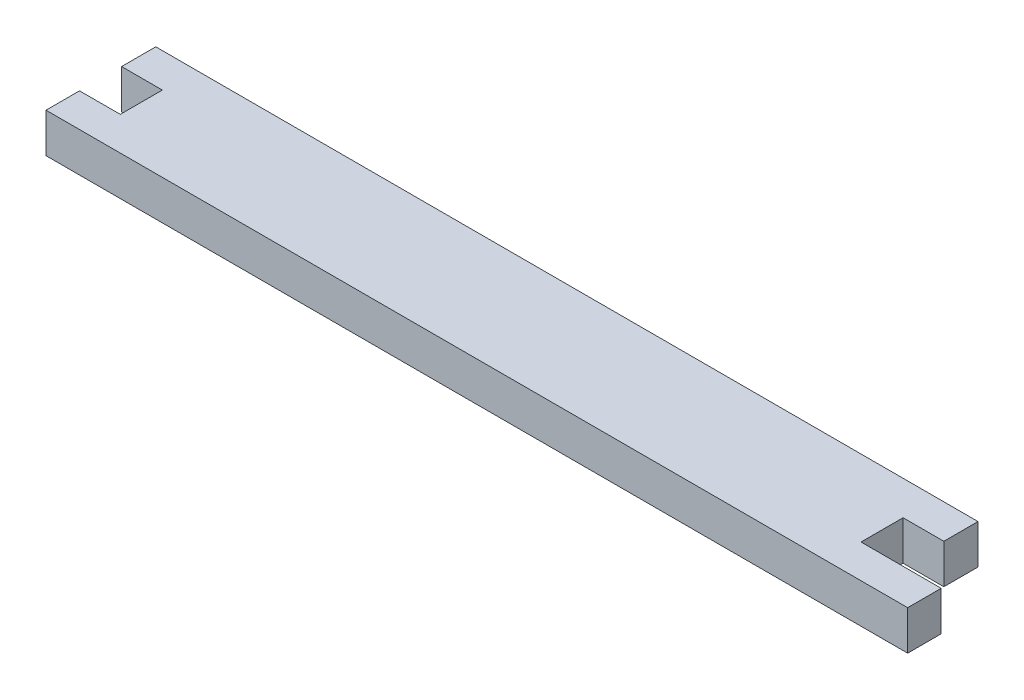
ISO-10303-21;
HEADER;
FILE_DESCRIPTION(('STEP AP214'),'2;1');
FILE_NAME('part.step','',(''),(''),'','','');
FILE_SCHEMA(('AUTOMOTIVE_DESIGN { 1 0 10303 214 1 1 1 1 }'));
ENDSEC;
DATA;
#1=APPLICATION_CONTEXT('core data for automotive mechanical design processes');
#2=APPLICATION_PROTOCOL_DEFINITION('international standard','automotive_design',2000,#1);
#3=PRODUCT_CONTEXT('',#1,'mechanical');
#4=PRODUCT('Part','Part','',(#3));
#5=PRODUCT_RELATED_PRODUCT_CATEGORY('part','',(#4));
#6=PRODUCT_DEFINITION_FORMATION('','',#4);
#7=PRODUCT_DEFINITION_CONTEXT('part definition',#1,'design');
#8=PRODUCT_DEFINITION('design','',#6,#7);
#9=PRODUCT_DEFINITION_SHAPE('','',#8);
#10=(LENGTH_UNIT() NAMED_UNIT(*) SI_UNIT(.MILLI.,.METRE.));
#11=(NAMED_UNIT(*) PLANE_ANGLE_UNIT() SI_UNIT($,.RADIAN.));
#12=(NAMED_UNIT(*) SI_UNIT($,.STERADIAN.) SOLID_ANGLE_UNIT());
#13=UNCERTAINTY_MEASURE_WITH_UNIT(LENGTH_MEASURE(1.E-05),#10,'distance_accuracy_value','');
#14=(GEOMETRIC_REPRESENTATION_CONTEXT(3) GLOBAL_UNCERTAINTY_ASSIGNED_CONTEXT((#13)) GLOBAL_UNIT_ASSIGNED_CONTEXT((#10,
#11,#12)) REPRESENTATION_CONTEXT('',''));
#15=CARTESIAN_POINT('',(0.,0.,0.));
#16=DIRECTION('',(0.,0.,1.));
#17=DIRECTION('',(1.,0.,0.));
#18=AXIS2_PLACEMENT_3D('',#15,#16,#17);
#19=CARTESIAN_POINT('',(-9.87424854704998,16.16,-16.8));
#20=DIRECTION('',(0.,-1.,0.));
#21=DIRECTION('',(0.,0.,-1.));
#22=AXIS2_PLACEMENT_3D('',#19,#20,#21);
#23=PLANE('',#22);
#24=DIRECTION('',(0.,0.,1.));
#25=VECTOR('',#24,1.);
#26=CARTESIAN_POINT('',(-0.999999999999997,16.16,-16.8));
#27=LINE('',#26,#25);
#28=CARTESIAN_POINT('',(-0.999999999999997,16.16,-16.8));
#29=VERTEX_POINT('',#28);
#30=CARTESIAN_POINT('',(-0.999999999999997,16.16,-14.2));
#31=VERTEX_POINT('',#30);
#32=EDGE_CURVE('E36',#29,#31,#27,.T.);
#33=ORIENTED_EDGE('',*,*,#32,.T.);
#34=DIRECTION('',(1.,0.,0.));
#35=VECTOR('',#34,1.);
#36=CARTESIAN_POINT('',(-9.87424854704998,16.16,-14.2));
#37=LINE('',#36,#35);
#38=CARTESIAN_POINT('',(2.1,16.16,-14.2));
#39=VERTEX_POINT('',#38);
#40=EDGE_CURVE('E172',#31,#39,#37,.T.);
#41=ORIENTED_EDGE('',*,*,#40,.T.);
#42=DIRECTION('',(0.,0.,1.));
#43=VECTOR('',#42,1.);
#44=CARTESIAN_POINT('',(2.1,16.16,-16.8));
#45=LINE('',#44,#43);
#46=CARTESIAN_POINT('',(2.1,16.16,-11.));
#47=VERTEX_POINT('',#46);
#48=EDGE_CURVE('E175',#39,#47,#45,.T.);
#49=ORIENTED_EDGE('',*,*,#48,.T.);
#50=DIRECTION('',(-1.,0.,0.));
#51=VECTOR('',#50,1.);
#52=CARTESIAN_POINT('',(-9.87424854704998,16.16,-11.));
#53=LINE('',#52,#51);
#54=CARTESIAN_POINT('',(-0.999999999999997,16.16,-11.));
#55=VERTEX_POINT('',#54);
#56=EDGE_CURVE('E165',#47,#55,#53,.T.);
#57=ORIENTED_EDGE('',*,*,#56,.T.);
#58=CARTESIAN_POINT('',(-0.999999999999997,16.16,-8.448216521316));
#59=VERTEX_POINT('',#58);
#60=EDGE_CURVE('E132',#55,#59,#27,.T.);
#61=ORIENTED_EDGE('',*,*,#60,.T.);
#62=DIRECTION('',(1.,0.,0.));
#63=VECTOR('',#62,1.);
#64=CARTESIAN_POINT('',(-9.87424854704998,16.16,-8.448216521316));
#65=LINE('',#64,#63);
#66=CARTESIAN_POINT('',(64.56,16.16,-8.448216521316));
#67=VERTEX_POINT('',#66);
#68=EDGE_CURVE('E123',#59,#67,#65,.T.);
#69=ORIENTED_EDGE('',*,*,#68,.T.);
#70=DIRECTION('',(0.,0.,1.));
#71=VECTOR('',#70,1.);
#72=CARTESIAN_POINT('',(64.56,16.16,-11.));
#73=LINE('',#72,#71);
#74=CARTESIAN_POINT('',(64.56,16.16,-11.));
#75=VERTEX_POINT('',#74);
#76=EDGE_CURVE('E128',#75,#67,#73,.T.);
#77=ORIENTED_EDGE('',*,*,#76,.F.);
#78=DIRECTION('',(-1.,0.,0.));
#79=VECTOR('',#78,1.);
#80=CARTESIAN_POINT('',(-9.87424854704998,16.16,-11.));
#81=LINE('',#80,#79);
#82=CARTESIAN_POINT('',(58.46,16.16,-11.));
#83=VERTEX_POINT('',#82);
#84=EDGE_CURVE('E194',#75,#83,#81,.T.);
#85=ORIENTED_EDGE('',*,*,#84,.T.);
#86=DIRECTION('',(0.,0.,-1.));
#87=VECTOR('',#86,1.);
#88=CARTESIAN_POINT('',(58.46,16.16,-16.8));
#89=LINE('',#88,#87);
#90=CARTESIAN_POINT('',(58.46,16.16,-14.2));
#91=VERTEX_POINT('',#90);
#92=EDGE_CURVE('E196',#83,#91,#89,.T.);
#93=ORIENTED_EDGE('',*,*,#92,.T.);
#94=DIRECTION('',(1.,0.,0.));
#95=VECTOR('',#94,1.);
#96=CARTESIAN_POINT('',(-9.87424854704998,16.16,-14.2));
#97=LINE('',#96,#95);
#98=CARTESIAN_POINT('',(61.56,16.16,-14.2));
#99=VERTEX_POINT('',#98);
#100=EDGE_CURVE('E188',#91,#99,#97,.T.);
#101=ORIENTED_EDGE('',*,*,#100,.T.);
#102=DIRECTION('',(0.,0.,-1.));
#103=VECTOR('',#102,1.);
#104=CARTESIAN_POINT('',(61.56,16.16,-16.8));
#105=LINE('',#104,#103);
#106=CARTESIAN_POINT('',(61.56,16.16,-16.8));
#107=VERTEX_POINT('',#106);
#108=EDGE_CURVE('E210',#99,#107,#105,.T.);
#109=ORIENTED_EDGE('',*,*,#108,.T.);
#110=DIRECTION('',(1.,0.,0.));
#111=VECTOR('',#110,1.);
#112=CARTESIAN_POINT('',(-9.87424854704998,16.16,-16.8));
#113=LINE('',#112,#111);
#114=EDGE_CURVE('E137',#29,#107,#113,.T.);
#115=ORIENTED_EDGE('',*,*,#114,.F.);
#116=EDGE_LOOP('',(#33,#41,#49,#57,#61,#69,#77,#85,#93,#101,#109,#115));
#117=FACE_BOUND('',#116,.T.);
#118=ADVANCED_FACE('F32',(#117),#23,.F.);
#119=CARTESIAN_POINT('',(-9.87424854704998,13.16,-16.8));
#120=DIRECTION('',(0.,1.,0.));
#121=DIRECTION('',(0.,0.,1.));
#122=AXIS2_PLACEMENT_3D('',#119,#120,#121);
#123=PLANE('',#122);
#124=DIRECTION('',(0.,0.,1.));
#125=VECTOR('',#124,1.);
#126=CARTESIAN_POINT('',(2.1,13.16,-14.2));
#127=LINE('',#126,#125);
#128=CARTESIAN_POINT('',(2.1,13.16,-14.2));
#129=VERTEX_POINT('',#128);
#130=CARTESIAN_POINT('',(2.1,13.16,-11.));
#131=VERTEX_POINT('',#130);
#132=EDGE_CURVE('E151',#129,#131,#127,.T.);
#133=ORIENTED_EDGE('',*,*,#132,.F.);
#134=DIRECTION('',(1.,0.,0.));
#135=VECTOR('',#134,1.);
#136=CARTESIAN_POINT('',(-0.999999999999997,13.16,-14.2));
#137=LINE('',#136,#135);
#138=CARTESIAN_POINT('',(-0.999999999999997,13.16,-14.2));
#139=VERTEX_POINT('',#138);
#140=EDGE_CURVE('E159',#139,#129,#137,.T.);
#141=ORIENTED_EDGE('',*,*,#140,.F.);
#142=DIRECTION('',(0.,0.,-1.));
#143=VECTOR('',#142,1.);
#144=CARTESIAN_POINT('',(-0.999999999999997,13.16,-16.8));
#145=LINE('',#144,#143);
#146=CARTESIAN_POINT('',(-0.999999999999997,13.16,-16.8));
#147=VERTEX_POINT('',#146);
#148=EDGE_CURVE('E202',#139,#147,#145,.T.);
#149=ORIENTED_EDGE('',*,*,#148,.T.);
#150=DIRECTION('',(1.,0.,0.));
#151=VECTOR('',#150,1.);
#152=CARTESIAN_POINT('',(-9.87424854704998,13.16,-16.8));
#153=LINE('',#152,#151);
#154=CARTESIAN_POINT('',(61.56,13.16,-16.8));
#155=VERTEX_POINT('',#154);
#156=EDGE_CURVE('E214',#147,#155,#153,.T.);
#157=ORIENTED_EDGE('',*,*,#156,.T.);
#158=DIRECTION('',(0.,0.,1.));
#159=VECTOR('',#158,1.);
#160=CARTESIAN_POINT('',(61.56,13.16,-16.8));
#161=LINE('',#160,#159);
#162=CARTESIAN_POINT('',(61.56,13.16,-14.2));
#163=VERTEX_POINT('',#162);
#164=EDGE_CURVE('E207',#155,#163,#161,.T.);
#165=ORIENTED_EDGE('',*,*,#164,.T.);
#166=DIRECTION('',(1.,0.,0.));
#167=VECTOR('',#166,1.);
#168=CARTESIAN_POINT('',(61.56,13.16,-14.2));
#169=LINE('',#168,#167);
#170=CARTESIAN_POINT('',(58.46,13.16,-14.2));
#171=VERTEX_POINT('',#170);
#172=EDGE_CURVE('E57',#171,#163,#169,.T.);
#173=ORIENTED_EDGE('',*,*,#172,.F.);
#174=DIRECTION('',(0.,0.,-1.));
#175=VECTOR('',#174,1.);
#176=CARTESIAN_POINT('',(58.46,13.16,-14.2));
#177=LINE('',#176,#175);
#178=CARTESIAN_POINT('',(58.46,13.16,-11.));
#179=VERTEX_POINT('',#178);
#180=EDGE_CURVE('E178',#179,#171,#177,.T.);
#181=ORIENTED_EDGE('',*,*,#180,.F.);
#182=DIRECTION('',(-1.,0.,0.));
#183=VECTOR('',#182,1.);
#184=CARTESIAN_POINT('',(58.46,13.16,-11.));
#185=LINE('',#184,#183);
#186=CARTESIAN_POINT('',(64.56,13.16,-11.));
#187=VERTEX_POINT('',#186);
#188=EDGE_CURVE('E182',#187,#179,#185,.T.);
#189=ORIENTED_EDGE('',*,*,#188,.F.);
#190=DIRECTION('',(0.,0.,-1.));
#191=VECTOR('',#190,1.);
#192=CARTESIAN_POINT('',(64.56,13.16,-8.448216521316));
#193=LINE('',#192,#191);
#194=CARTESIAN_POINT('',(64.56,13.16,-8.448216521316));
#195=VERTEX_POINT('',#194);
#196=EDGE_CURVE('E146',#195,#187,#193,.T.);
#197=ORIENTED_EDGE('',*,*,#196,.F.);
#198=DIRECTION('',(1.,0.,0.));
#199=VECTOR('',#198,1.);
#200=CARTESIAN_POINT('',(-9.87424854704998,13.16,-8.448216521316));
#201=LINE('',#200,#199);
#202=CARTESIAN_POINT('',(-0.999999999999997,13.16,-8.448216521316));
#203=VERTEX_POINT('',#202);
#204=EDGE_CURVE('E136',#203,#195,#201,.T.);
#205=ORIENTED_EDGE('',*,*,#204,.F.);
#206=CARTESIAN_POINT('',(-0.999999999999997,13.16,-11.));
#207=VERTEX_POINT('',#206);
#208=EDGE_CURVE('E41',#203,#207,#145,.T.);
#209=ORIENTED_EDGE('',*,*,#208,.T.);
#210=DIRECTION('',(-1.,0.,0.));
#211=VECTOR('',#210,1.);
#212=CARTESIAN_POINT('',(2.1,13.16,-11.));
#213=LINE('',#212,#211);
#214=EDGE_CURVE('E49',#131,#207,#213,.T.);
#215=ORIENTED_EDGE('',*,*,#214,.F.);
#216=EDGE_LOOP('',(#133,#141,#149,#157,#165,#173,#181,#189,#197,#205,#209,#215));
#217=FACE_BOUND('',#216,.T.);
#218=ADVANCED_FACE('F230',(#217),#123,.F.);
#219=CARTESIAN_POINT('',(-0.999999999999997,0.,0.));
#220=DIRECTION('',(1.,0.,0.));
#221=DIRECTION('',(0.,0.,-1.));
#222=AXIS2_PLACEMENT_3D('',#219,#220,#221);
#223=PLANE('',#222);
#224=ORIENTED_EDGE('',*,*,#148,.F.);
#225=DIRECTION('',(0.,-1.,0.));
#226=VECTOR('',#225,1.);
#227=CARTESIAN_POINT('',(-0.999999999999997,72.14,-14.2));
#228=LINE('',#227,#226);
#229=EDGE_CURVE('E166',#31,#139,#228,.T.);
#230=ORIENTED_EDGE('',*,*,#229,.F.);
#231=ORIENTED_EDGE('',*,*,#32,.F.);
#232=DIRECTION('',(0.,1.,0.));
#233=VECTOR('',#232,1.);
#234=CARTESIAN_POINT('',(-0.999999999999997,13.16,-16.8));
#235=LINE('',#234,#233);
#236=EDGE_CURVE('E11',#147,#29,#235,.T.);
#237=ORIENTED_EDGE('',*,*,#236,.F.);
#238=EDGE_LOOP('',(#224,#230,#231,#237));
#239=FACE_BOUND('',#238,.T.);
#240=ADVANCED_FACE('F223',(#239),#223,.F.);
#241=ORIENTED_EDGE('',*,*,#60,.F.);
#242=DIRECTION('',(0.,-1.,0.));
#243=VECTOR('',#242,1.);
#244=CARTESIAN_POINT('',(-0.999999999999997,72.14,-11.));
#245=LINE('',#244,#243);
#246=EDGE_CURVE('E168',#55,#207,#245,.T.);
#247=ORIENTED_EDGE('',*,*,#246,.T.);
#248=ORIENTED_EDGE('',*,*,#208,.F.);
#249=DIRECTION('',(0.,-1.,0.));
#250=VECTOR('',#249,1.);
#251=CARTESIAN_POINT('',(-0.999999999999997,13.16,-8.448216521316));
#252=LINE('',#251,#250);
#253=EDGE_CURVE('E200',#59,#203,#252,.T.);
#254=ORIENTED_EDGE('',*,*,#253,.F.);
#255=EDGE_LOOP('',(#241,#247,#248,#254));
#256=FACE_BOUND('',#255,.T.);
#257=ADVANCED_FACE('F239',(#256),#223,.F.);
#258=CARTESIAN_POINT('',(61.56,0.,0.));
#259=DIRECTION('',(1.,0.,0.));
#260=DIRECTION('',(0.,0.,-1.));
#261=AXIS2_PLACEMENT_3D('',#258,#259,#260);
#262=PLANE('',#261);
#263=DIRECTION('',(0.,-1.,0.));
#264=VECTOR('',#263,1.);
#265=CARTESIAN_POINT('',(61.56,72.14,-14.2));
#266=LINE('',#265,#264);
#267=EDGE_CURVE('E189',#99,#163,#266,.T.);
#268=ORIENTED_EDGE('',*,*,#267,.T.);
#269=ORIENTED_EDGE('',*,*,#164,.F.);
#270=DIRECTION('',(0.,-1.,0.));
#271=VECTOR('',#270,1.);
#272=CARTESIAN_POINT('',(61.56,13.16,-16.8));
#273=LINE('',#272,#271);
#274=EDGE_CURVE('E199',#107,#155,#273,.T.);
#275=ORIENTED_EDGE('',*,*,#274,.F.);
#276=ORIENTED_EDGE('',*,*,#108,.F.);
#277=EDGE_LOOP('',(#268,#269,#275,#276));
#278=FACE_BOUND('',#277,.T.);
#279=ADVANCED_FACE('F228',(#278),#262,.T.);
#280=CARTESIAN_POINT('',(-9.87424854704998,13.16,-8.448216521316));
#281=DIRECTION('',(0.,0.,-1.));
#282=DIRECTION('',(-1.,0.,0.));
#283=AXIS2_PLACEMENT_3D('',#280,#281,#282);
#284=PLANE('',#283);
#285=ORIENTED_EDGE('',*,*,#68,.F.);
#286=ORIENTED_EDGE('',*,*,#253,.T.);
#287=ORIENTED_EDGE('',*,*,#204,.T.);
#288=DIRECTION('',(0.,-1.,0.));
#289=VECTOR('',#288,1.);
#290=CARTESIAN_POINT('',(64.56,16.16,-8.448216521316));
#291=LINE('',#290,#289);
#292=EDGE_CURVE('E140',#67,#195,#291,.T.);
#293=ORIENTED_EDGE('',*,*,#292,.F.);
#294=EDGE_LOOP('',(#285,#286,#287,#293));
#295=FACE_BOUND('',#294,.T.);
#296=ADVANCED_FACE('F141',(#295),#284,.F.);
#297=CARTESIAN_POINT('',(-9.87424854704998,13.16,-16.8));
#298=DIRECTION('',(0.,0.,1.));
#299=DIRECTION('',(1.,0.,0.));
#300=AXIS2_PLACEMENT_3D('',#297,#298,#299);
#301=PLANE('',#300);
#302=ORIENTED_EDGE('',*,*,#156,.F.);
#303=ORIENTED_EDGE('',*,*,#236,.T.);
#304=ORIENTED_EDGE('',*,*,#114,.T.);
#305=ORIENTED_EDGE('',*,*,#274,.T.);
#306=EDGE_LOOP('',(#302,#303,#304,#305));
#307=FACE_BOUND('',#306,.T.);
#308=ADVANCED_FACE('F34',(#307),#301,.F.);
#309=CARTESIAN_POINT('',(58.46,72.14,-14.2));
#310=DIRECTION('',(-1.,0.,0.));
#311=DIRECTION('',(0.,0.,1.));
#312=AXIS2_PLACEMENT_3D('',#309,#310,#311);
#313=PLANE('',#312);
#314=DIRECTION('',(0.,-1.,0.));
#315=VECTOR('',#314,1.);
#316=CARTESIAN_POINT('',(58.46,72.14,-11.));
#317=LINE('',#316,#315);
#318=EDGE_CURVE('E186',#83,#179,#317,.T.);
#319=ORIENTED_EDGE('',*,*,#318,.T.);
#320=ORIENTED_EDGE('',*,*,#180,.T.);
#321=DIRECTION('',(0.,-1.,0.));
#322=VECTOR('',#321,1.);
#323=CARTESIAN_POINT('',(58.46,72.14,-14.2));
#324=LINE('',#323,#322);
#325=EDGE_CURVE('E185',#91,#171,#324,.T.);
#326=ORIENTED_EDGE('',*,*,#325,.F.);
#327=ORIENTED_EDGE('',*,*,#92,.F.);
#328=EDGE_LOOP('',(#319,#320,#326,#327));
#329=FACE_BOUND('',#328,.T.);
#330=ADVANCED_FACE('F234',(#329),#313,.F.);
#331=CARTESIAN_POINT('',(58.46,72.14,-11.));
#332=DIRECTION('',(0.,0.,1.));
#333=DIRECTION('',(1.,0.,0.));
#334=AXIS2_PLACEMENT_3D('',#331,#332,#333);
#335=PLANE('',#334);
#336=ORIENTED_EDGE('',*,*,#84,.F.);
#337=DIRECTION('',(0.,1.,0.));
#338=VECTOR('',#337,1.);
#339=CARTESIAN_POINT('',(64.56,13.16,-11.));
#340=LINE('',#339,#338);
#341=EDGE_CURVE('E150',#187,#75,#340,.T.);
#342=ORIENTED_EDGE('',*,*,#341,.F.);
#343=ORIENTED_EDGE('',*,*,#188,.T.);
#344=ORIENTED_EDGE('',*,*,#318,.F.);
#345=EDGE_LOOP('',(#336,#342,#343,#344));
#346=FACE_BOUND('',#345,.T.);
#347=ADVANCED_FACE('F237',(#346),#335,.F.);
#348=CARTESIAN_POINT('',(61.56,72.14,-14.2));
#349=DIRECTION('',(0.,0.,-1.));
#350=DIRECTION('',(-1.,0.,0.));
#351=AXIS2_PLACEMENT_3D('',#348,#349,#350);
#352=PLANE('',#351);
#353=ORIENTED_EDGE('',*,*,#325,.T.);
#354=ORIENTED_EDGE('',*,*,#172,.T.);
#355=ORIENTED_EDGE('',*,*,#267,.F.);
#356=ORIENTED_EDGE('',*,*,#100,.F.);
#357=EDGE_LOOP('',(#353,#354,#355,#356));
#358=FACE_BOUND('',#357,.T.);
#359=ADVANCED_FACE('F255',(#358),#352,.F.);
#360=CARTESIAN_POINT('',(2.1,72.14,-14.2));
#361=DIRECTION('',(1.,0.,0.));
#362=DIRECTION('',(0.,0.,-1.));
#363=AXIS2_PLACEMENT_3D('',#360,#361,#362);
#364=PLANE('',#363);
#365=DIRECTION('',(0.,-1.,0.));
#366=VECTOR('',#365,1.);
#367=CARTESIAN_POINT('',(2.1,72.14,-14.2));
#368=LINE('',#367,#366);
#369=EDGE_CURVE('E163',#39,#129,#368,.T.);
#370=ORIENTED_EDGE('',*,*,#369,.T.);
#371=ORIENTED_EDGE('',*,*,#132,.T.);
#372=DIRECTION('',(0.,-1.,0.));
#373=VECTOR('',#372,1.);
#374=CARTESIAN_POINT('',(2.1,72.14,-11.));
#375=LINE('',#374,#373);
#376=EDGE_CURVE('E162',#47,#131,#375,.T.);
#377=ORIENTED_EDGE('',*,*,#376,.F.);
#378=ORIENTED_EDGE('',*,*,#48,.F.);
#379=EDGE_LOOP('',(#370,#371,#377,#378));
#380=FACE_BOUND('',#379,.T.);
#381=ADVANCED_FACE('F244',(#380),#364,.F.);
#382=CARTESIAN_POINT('',(-0.999999999999997,72.14,-14.2));
#383=DIRECTION('',(0.,0.,-1.));
#384=DIRECTION('',(-1.,0.,0.));
#385=AXIS2_PLACEMENT_3D('',#382,#383,#384);
#386=PLANE('',#385);
#387=ORIENTED_EDGE('',*,*,#229,.T.);
#388=ORIENTED_EDGE('',*,*,#140,.T.);
#389=ORIENTED_EDGE('',*,*,#369,.F.);
#390=ORIENTED_EDGE('',*,*,#40,.F.);
#391=EDGE_LOOP('',(#387,#388,#389,#390));
#392=FACE_BOUND('',#391,.T.);
#393=ADVANCED_FACE('F246',(#392),#386,.F.);
#394=CARTESIAN_POINT('',(2.1,72.14,-11.));
#395=DIRECTION('',(0.,0.,1.));
#396=DIRECTION('',(1.,0.,0.));
#397=AXIS2_PLACEMENT_3D('',#394,#395,#396);
#398=PLANE('',#397);
#399=ORIENTED_EDGE('',*,*,#376,.T.);
#400=ORIENTED_EDGE('',*,*,#214,.T.);
#401=ORIENTED_EDGE('',*,*,#246,.F.);
#402=ORIENTED_EDGE('',*,*,#56,.F.);
#403=EDGE_LOOP('',(#399,#400,#401,#402));
#404=FACE_BOUND('',#403,.T.);
#405=ADVANCED_FACE('F240',(#404),#398,.F.);
#406=CARTESIAN_POINT('',(64.56,0.,0.));
#407=DIRECTION('',(1.,0.,0.));
#408=DIRECTION('',(0.,0.,-1.));
#409=AXIS2_PLACEMENT_3D('',#406,#407,#408);
#410=PLANE('',#409);
#411=ORIENTED_EDGE('',*,*,#292,.T.);
#412=ORIENTED_EDGE('',*,*,#196,.T.);
#413=ORIENTED_EDGE('',*,*,#341,.T.);
#414=ORIENTED_EDGE('',*,*,#76,.T.);
#415=EDGE_LOOP('',(#411,#412,#413,#414));
#416=FACE_BOUND('',#415,.T.);
#417=ADVANCED_FACE('F148',(#416),#410,.T.);
#418=CLOSED_SHELL('',(#118,#218,#240,#257,#279,#296,#308,#330,#347,#359,#381,#393,#405,#417));
#419=MANIFOLD_SOLID_BREP('B2',#418);
#420=ADVANCED_BREP_SHAPE_REPRESENTATION('',(#18,#419),#14);
#421=SHAPE_DEFINITION_REPRESENTATION(#9,#420);
ENDSEC;
END-ISO-10303-21;
